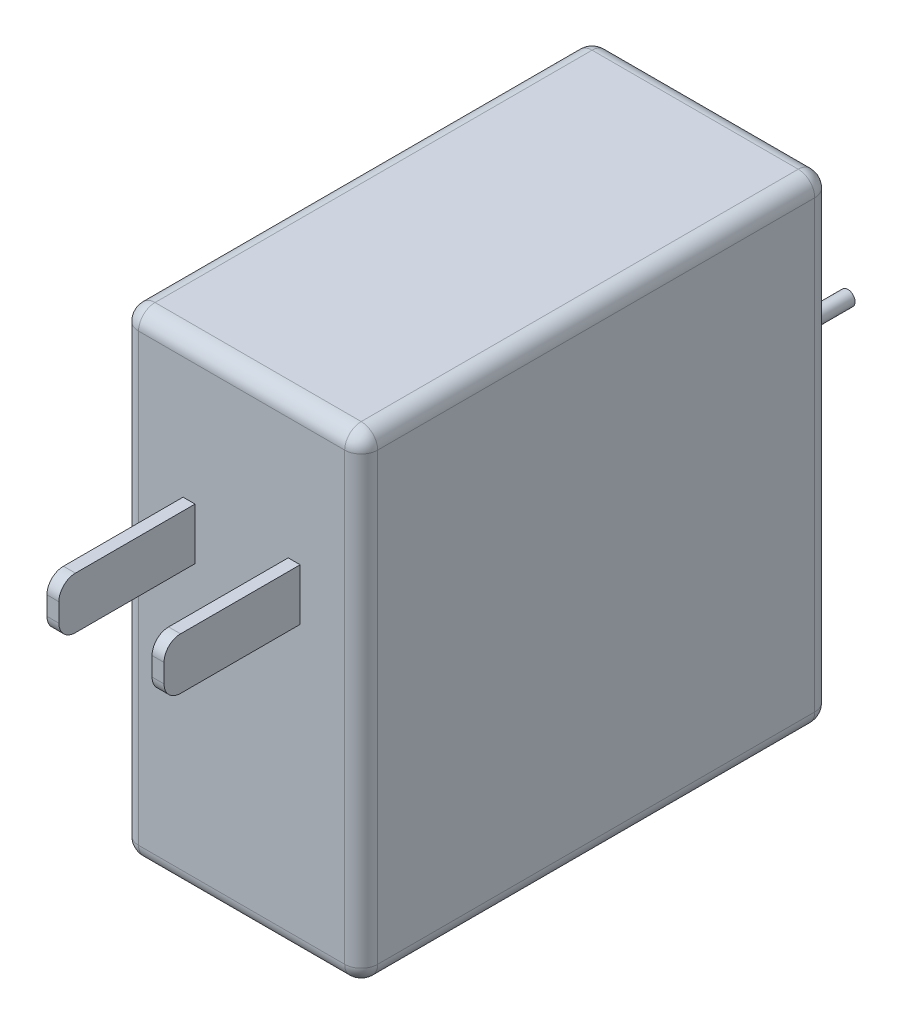
ISO-10303-21;
HEADER;
FILE_DESCRIPTION(('STEP AP214'),'2;1');
FILE_NAME('part.step','',(''),(''),'','','');
FILE_SCHEMA(('AUTOMOTIVE_DESIGN { 1 0 10303 214 1 1 1 1 }'));
ENDSEC;
DATA;
#1=APPLICATION_CONTEXT('core data for automotive mechanical design processes');
#2=APPLICATION_PROTOCOL_DEFINITION('international standard','automotive_design',2000,#1);
#3=PRODUCT_CONTEXT('',#1,'mechanical');
#4=PRODUCT('Part','Part','',(#3));
#5=PRODUCT_RELATED_PRODUCT_CATEGORY('part','',(#4));
#6=PRODUCT_DEFINITION_FORMATION('','',#4);
#7=PRODUCT_DEFINITION_CONTEXT('part definition',#1,'design');
#8=PRODUCT_DEFINITION('design','',#6,#7);
#9=PRODUCT_DEFINITION_SHAPE('','',#8);
#10=(LENGTH_UNIT() NAMED_UNIT(*) SI_UNIT(.MILLI.,.METRE.));
#11=(NAMED_UNIT(*) PLANE_ANGLE_UNIT() SI_UNIT($,.RADIAN.));
#12=(NAMED_UNIT(*) SI_UNIT($,.STERADIAN.) SOLID_ANGLE_UNIT());
#13=UNCERTAINTY_MEASURE_WITH_UNIT(LENGTH_MEASURE(1.E-05),#10,'distance_accuracy_value','');
#14=(GEOMETRIC_REPRESENTATION_CONTEXT(3) GLOBAL_UNCERTAINTY_ASSIGNED_CONTEXT((#13)) GLOBAL_UNIT_ASSIGNED_CONTEXT((#10,
#11,#12)) REPRESENTATION_CONTEXT('',''));
#15=CARTESIAN_POINT('',(0.,0.,0.));
#16=DIRECTION('',(0.,0.,1.));
#17=DIRECTION('',(1.,0.,0.));
#18=AXIS2_PLACEMENT_3D('',#15,#16,#17);
#19=CARTESIAN_POINT('',(0.,0.,-57.));
#20=DIRECTION('',(0.,0.,1.));
#21=DIRECTION('',(1.,0.,0.));
#22=AXIS2_PLACEMENT_3D('',#19,#20,#21);
#23=PLANE('',#22);
#24=DIRECTION('',(0.,-1.,0.));
#25=VECTOR('',#24,1.);
#26=CARTESIAN_POINT('',(-12.5,29.,-57.));
#27=LINE('',#26,#25);
#28=CARTESIAN_POINT('',(-12.5,-27.,-57.));
#29=VERTEX_POINT('',#28);
#30=CARTESIAN_POINT('',(-12.5,27.,-57.));
#31=VERTEX_POINT('',#30);
#32=EDGE_CURVE('E291',#29,#31,#27,.F.);
#33=ORIENTED_EDGE('',*,*,#32,.T.);
#34=DIRECTION('',(1.,0.,0.));
#35=VECTOR('',#34,1.);
#36=CARTESIAN_POINT('',(0.,27.,-57.));
#37=LINE('',#36,#35);
#38=CARTESIAN_POINT('',(12.5,27.,-57.));
#39=VERTEX_POINT('',#38);
#40=EDGE_CURVE('E293',#31,#39,#37,.T.);
#41=ORIENTED_EDGE('',*,*,#40,.T.);
#42=DIRECTION('',(0.,-1.,0.));
#43=VECTOR('',#42,1.);
#44=CARTESIAN_POINT('',(12.5,0.,-57.));
#45=LINE('',#44,#43);
#46=CARTESIAN_POINT('',(12.5,-27.,-57.));
#47=VERTEX_POINT('',#46);
#48=EDGE_CURVE('E287',#39,#47,#45,.T.);
#49=ORIENTED_EDGE('',*,*,#48,.T.);
#50=DIRECTION('',(1.,0.,0.));
#51=VECTOR('',#50,1.);
#52=CARTESIAN_POINT('',(-14.5,-27.,-57.));
#53=LINE('',#52,#51);
#54=EDGE_CURVE('E289',#47,#29,#53,.F.);
#55=ORIENTED_EDGE('',*,*,#54,.T.);
#56=EDGE_LOOP('',(#33,#41,#49,#55));
#57=FACE_BOUND('',#56,.T.);
#58=CARTESIAN_POINT('',(0.,0.,-57.));
#59=DIRECTION('',(0.,0.,1.));
#60=DIRECTION('',(1.,0.,0.));
#61=AXIS2_PLACEMENT_3D('',#58,#59,#60);
#62=CIRCLE('',#61,1.88845811923033);
#63=CARTESIAN_POINT('',(1.88845811923033,0.,-57.));
#64=VERTEX_POINT('',#63);
#65=EDGE_CURVE('E355',#64,#64,#62,.F.);
#66=ORIENTED_EDGE('',*,*,#65,.F.);
#67=EDGE_LOOP('',(#66));
#68=FACE_BOUND('',#67,.T.);
#69=ADVANCED_FACE('F38',(#57,#68),#23,.F.);
#70=CARTESIAN_POINT('',(14.5,0.,-57.));
#71=DIRECTION('',(-1.,0.,0.));
#72=DIRECTION('',(0.,-1.,0.));
#73=AXIS2_PLACEMENT_3D('',#70,#71,#72);
#74=PLANE('',#73);
#75=DIRECTION('',(0.,0.,1.));
#76=VECTOR('',#75,1.);
#77=CARTESIAN_POINT('',(14.5,-27.,-57.));
#78=LINE('',#77,#76);
#79=CARTESIAN_POINT('',(14.5,-27.,-2.));
#80=VERTEX_POINT('',#79);
#81=CARTESIAN_POINT('',(14.5,-27.,-55.));
#82=VERTEX_POINT('',#81);
#83=EDGE_CURVE('E298',#80,#82,#78,.F.);
#84=ORIENTED_EDGE('',*,*,#83,.T.);
#85=DIRECTION('',(0.,-1.,0.));
#86=VECTOR('',#85,1.);
#87=CARTESIAN_POINT('',(14.5,0.,-55.));
#88=LINE('',#87,#86);
#89=CARTESIAN_POINT('',(14.5,27.,-55.));
#90=VERTEX_POINT('',#89);
#91=EDGE_CURVE('E303',#82,#90,#88,.F.);
#92=ORIENTED_EDGE('',*,*,#91,.T.);
#93=DIRECTION('',(0.,0.,1.));
#94=VECTOR('',#93,1.);
#95=CARTESIAN_POINT('',(14.5,27.,-57.));
#96=LINE('',#95,#94);
#97=CARTESIAN_POINT('',(14.5,27.,-2.));
#98=VERTEX_POINT('',#97);
#99=EDGE_CURVE('E300',#90,#98,#96,.T.);
#100=ORIENTED_EDGE('',*,*,#99,.T.);
#101=DIRECTION('',(0.,-1.,0.));
#102=VECTOR('',#101,1.);
#103=CARTESIAN_POINT('',(14.5,-29.,-2.));
#104=LINE('',#103,#102);
#105=EDGE_CURVE('E296',#98,#80,#104,.T.);
#106=ORIENTED_EDGE('',*,*,#105,.T.);
#107=EDGE_LOOP('',(#84,#92,#100,#106));
#108=FACE_BOUND('',#107,.T.);
#109=ADVANCED_FACE('F438',(#108),#74,.F.);
#110=CARTESIAN_POINT('',(0.,-29.,-57.));
#111=DIRECTION('',(0.,-1.,0.));
#112=DIRECTION('',(0.,0.,-1.));
#113=AXIS2_PLACEMENT_3D('',#110,#111,#112);
#114=PLANE('',#113);
#115=DIRECTION('',(0.,0.,1.));
#116=VECTOR('',#115,1.);
#117=CARTESIAN_POINT('',(12.5,-29.,0.));
#118=LINE('',#117,#116);
#119=CARTESIAN_POINT('',(12.5,-29.,-55.));
#120=VERTEX_POINT('',#119);
#121=CARTESIAN_POINT('',(12.5,-29.,-2.));
#122=VERTEX_POINT('',#121);
#123=EDGE_CURVE('E348',#120,#122,#118,.T.);
#124=ORIENTED_EDGE('',*,*,#123,.T.);
#125=DIRECTION('',(1.,0.,0.));
#126=VECTOR('',#125,1.);
#127=CARTESIAN_POINT('',(0.,-29.,-2.));
#128=LINE('',#127,#126);
#129=CARTESIAN_POINT('',(-12.5,-29.,-2.));
#130=VERTEX_POINT('',#129);
#131=EDGE_CURVE('E353',#122,#130,#128,.F.);
#132=ORIENTED_EDGE('',*,*,#131,.T.);
#133=DIRECTION('',(0.,0.,1.));
#134=VECTOR('',#133,1.);
#135=CARTESIAN_POINT('',(-12.5,-29.,-57.));
#136=LINE('',#135,#134);
#137=CARTESIAN_POINT('',(-12.5,-29.,-55.));
#138=VERTEX_POINT('',#137);
#139=EDGE_CURVE('E61',#130,#138,#136,.F.);
#140=ORIENTED_EDGE('',*,*,#139,.T.);
#141=DIRECTION('',(1.,0.,0.));
#142=VECTOR('',#141,1.);
#143=CARTESIAN_POINT('',(14.5,-29.,-55.));
#144=LINE('',#143,#142);
#145=EDGE_CURVE('E350',#138,#120,#144,.T.);
#146=ORIENTED_EDGE('',*,*,#145,.T.);
#147=EDGE_LOOP('',(#124,#132,#140,#146));
#148=FACE_BOUND('',#147,.T.);
#149=ADVANCED_FACE('F444',(#148),#114,.T.);
#150=CARTESIAN_POINT('',(-14.5,0.,-57.));
#151=DIRECTION('',(-1.,0.,0.));
#152=DIRECTION('',(0.,-1.,0.));
#153=AXIS2_PLACEMENT_3D('',#150,#151,#152);
#154=PLANE('',#153);
#155=DIRECTION('',(0.,-1.,0.));
#156=VECTOR('',#155,1.);
#157=CARTESIAN_POINT('',(-14.5,0.,-2.));
#158=LINE('',#157,#156);
#159=CARTESIAN_POINT('',(-14.5,-27.,-2.));
#160=VERTEX_POINT('',#159);
#161=CARTESIAN_POINT('',(-14.5,27.,-2.));
#162=VERTEX_POINT('',#161);
#163=EDGE_CURVE('E282',#160,#162,#158,.F.);
#164=ORIENTED_EDGE('',*,*,#163,.T.);
#165=DIRECTION('',(0.,0.,1.));
#166=VECTOR('',#165,1.);
#167=CARTESIAN_POINT('',(-14.5,27.,-57.));
#168=LINE('',#167,#166);
#169=CARTESIAN_POINT('',(-14.5,27.,-55.));
#170=VERTEX_POINT('',#169);
#171=EDGE_CURVE('E284',#162,#170,#168,.F.);
#172=ORIENTED_EDGE('',*,*,#171,.T.);
#173=DIRECTION('',(0.,-1.,0.));
#174=VECTOR('',#173,1.);
#175=CARTESIAN_POINT('',(-14.5,-29.,-55.));
#176=LINE('',#175,#174);
#177=CARTESIAN_POINT('',(-14.5,-27.,-55.));
#178=VERTEX_POINT('',#177);
#179=EDGE_CURVE('E280',#170,#178,#176,.T.);
#180=ORIENTED_EDGE('',*,*,#179,.T.);
#181=DIRECTION('',(0.,0.,1.));
#182=VECTOR('',#181,1.);
#183=CARTESIAN_POINT('',(-14.5,-27.,-57.));
#184=LINE('',#183,#182);
#185=EDGE_CURVE('E278',#178,#160,#184,.T.);
#186=ORIENTED_EDGE('',*,*,#185,.T.);
#187=EDGE_LOOP('',(#164,#172,#180,#186));
#188=FACE_BOUND('',#187,.T.);
#189=ADVANCED_FACE('F458',(#188),#154,.T.);
#190=CARTESIAN_POINT('',(0.,29.,-57.));
#191=DIRECTION('',(0.,-1.,0.));
#192=DIRECTION('',(0.,0.,-1.));
#193=AXIS2_PLACEMENT_3D('',#190,#191,#192);
#194=PLANE('',#193);
#195=DIRECTION('',(1.,0.,0.));
#196=VECTOR('',#195,1.);
#197=CARTESIAN_POINT('',(0.,29.,-55.));
#198=LINE('',#197,#196);
#199=CARTESIAN_POINT('',(12.5,29.,-55.));
#200=VERTEX_POINT('',#199);
#201=CARTESIAN_POINT('',(-12.5,29.,-55.));
#202=VERTEX_POINT('',#201);
#203=EDGE_CURVE('E273',#200,#202,#198,.F.);
#204=ORIENTED_EDGE('',*,*,#203,.T.);
#205=DIRECTION('',(0.,0.,1.));
#206=VECTOR('',#205,1.);
#207=CARTESIAN_POINT('',(-12.5,29.,0.));
#208=LINE('',#207,#206);
#209=CARTESIAN_POINT('',(-12.5,29.,-2.));
#210=VERTEX_POINT('',#209);
#211=EDGE_CURVE('E275',#202,#210,#208,.T.);
#212=ORIENTED_EDGE('',*,*,#211,.T.);
#213=DIRECTION('',(1.,0.,0.));
#214=VECTOR('',#213,1.);
#215=CARTESIAN_POINT('',(14.5,29.,-2.));
#216=LINE('',#215,#214);
#217=CARTESIAN_POINT('',(12.5,29.,-2.));
#218=VERTEX_POINT('',#217);
#219=EDGE_CURVE('E269',#210,#218,#216,.T.);
#220=ORIENTED_EDGE('',*,*,#219,.T.);
#221=DIRECTION('',(0.,0.,1.));
#222=VECTOR('',#221,1.);
#223=CARTESIAN_POINT('',(12.5,29.,-57.));
#224=LINE('',#223,#222);
#225=EDGE_CURVE('E271',#218,#200,#224,.F.);
#226=ORIENTED_EDGE('',*,*,#225,.T.);
#227=EDGE_LOOP('',(#204,#212,#220,#226));
#228=FACE_BOUND('',#227,.T.);
#229=ADVANCED_FACE('F454',(#228),#194,.F.);
#230=CARTESIAN_POINT('',(0.,0.,0.));
#231=DIRECTION('',(0.,0.,1.));
#232=DIRECTION('',(1.,0.,0.));
#233=AXIS2_PLACEMENT_3D('',#230,#231,#232);
#234=PLANE('',#233);
#235=DIRECTION('',(1.,0.,0.));
#236=VECTOR('',#235,1.);
#237=CARTESIAN_POINT('',(-14.5,27.,0.));
#238=LINE('',#237,#236);
#239=CARTESIAN_POINT('',(12.5,27.,0.));
#240=VERTEX_POINT('',#239);
#241=CARTESIAN_POINT('',(-12.5,27.,0.));
#242=VERTEX_POINT('',#241);
#243=EDGE_CURVE('E309',#240,#242,#238,.F.);
#244=ORIENTED_EDGE('',*,*,#243,.T.);
#245=DIRECTION('',(0.,-1.,0.));
#246=VECTOR('',#245,1.);
#247=CARTESIAN_POINT('',(-12.5,0.,0.));
#248=LINE('',#247,#246);
#249=CARTESIAN_POINT('',(-12.5,-27.,0.));
#250=VERTEX_POINT('',#249);
#251=EDGE_CURVE('E312',#242,#250,#248,.T.);
#252=ORIENTED_EDGE('',*,*,#251,.T.);
#253=DIRECTION('',(1.,0.,0.));
#254=VECTOR('',#253,1.);
#255=CARTESIAN_POINT('',(0.,-27.,0.));
#256=LINE('',#255,#254);
#257=CARTESIAN_POINT('',(12.5,-27.,0.));
#258=VERTEX_POINT('',#257);
#259=EDGE_CURVE('E307',#250,#258,#256,.T.);
#260=ORIENTED_EDGE('',*,*,#259,.T.);
#261=DIRECTION('',(0.,-1.,0.));
#262=VECTOR('',#261,1.);
#263=CARTESIAN_POINT('',(12.5,29.,0.));
#264=LINE('',#263,#262);
#265=EDGE_CURVE('E305',#258,#240,#264,.F.);
#266=ORIENTED_EDGE('',*,*,#265,.T.);
#267=EDGE_LOOP('',(#244,#252,#260,#266));
#268=FACE_BOUND('',#267,.T.);
#269=DIRECTION('',(-1.,0.,0.));
#270=VECTOR('',#269,1.);
#271=CARTESIAN_POINT('',(0.,6.00000000000001,0.));
#272=LINE('',#271,#270);
#273=CARTESIAN_POINT('',(7.10000000000001,6.00000000000001,0.));
#274=VERTEX_POINT('',#273);
#275=CARTESIAN_POINT('',(5.65000000000001,6.00000000000001,0.));
#276=VERTEX_POINT('',#275);
#277=EDGE_CURVE('E219',#274,#276,#272,.T.);
#278=ORIENTED_EDGE('',*,*,#277,.T.);
#279=DIRECTION('',(0.,-1.,0.));
#280=VECTOR('',#279,1.);
#281=CARTESIAN_POINT('',(5.65000000000001,0.,0.));
#282=LINE('',#281,#280);
#283=CARTESIAN_POINT('',(5.65000000000001,12.26,0.));
#284=VERTEX_POINT('',#283);
#285=EDGE_CURVE('E233',#284,#276,#282,.T.);
#286=ORIENTED_EDGE('',*,*,#285,.F.);
#287=DIRECTION('',(-1.,0.,0.));
#288=VECTOR('',#287,1.);
#289=CARTESIAN_POINT('',(0.,12.26,0.));
#290=LINE('',#289,#288);
#291=CARTESIAN_POINT('',(7.10000000000001,12.26,0.));
#292=VERTEX_POINT('',#291);
#293=EDGE_CURVE('E231',#292,#284,#290,.T.);
#294=ORIENTED_EDGE('',*,*,#293,.F.);
#295=DIRECTION('',(0.,-1.,0.));
#296=VECTOR('',#295,1.);
#297=CARTESIAN_POINT('',(7.10000000000001,0.,0.));
#298=LINE('',#297,#296);
#299=EDGE_CURVE('E208',#292,#274,#298,.T.);
#300=ORIENTED_EDGE('',*,*,#299,.T.);
#301=EDGE_LOOP('',(#278,#286,#294,#300));
#302=FACE_BOUND('',#301,.T.);
#303=DIRECTION('',(0.,-1.,0.));
#304=VECTOR('',#303,1.);
#305=CARTESIAN_POINT('',(-5.65,0.,0.));
#306=LINE('',#305,#304);
#307=CARTESIAN_POINT('',(-5.65,12.26,0.));
#308=VERTEX_POINT('',#307);
#309=CARTESIAN_POINT('',(-5.65,6.00000000000001,0.));
#310=VERTEX_POINT('',#309);
#311=EDGE_CURVE('E215',#308,#310,#306,.T.);
#312=ORIENTED_EDGE('',*,*,#311,.T.);
#313=DIRECTION('',(1.,0.,0.));
#314=VECTOR('',#313,1.);
#315=CARTESIAN_POINT('',(0.,6.00000000000001,0.));
#316=LINE('',#315,#314);
#317=CARTESIAN_POINT('',(-7.10000000000001,6.00000000000001,0.));
#318=VERTEX_POINT('',#317);
#319=EDGE_CURVE('E248',#318,#310,#316,.T.);
#320=ORIENTED_EDGE('',*,*,#319,.F.);
#321=DIRECTION('',(0.,-1.,0.));
#322=VECTOR('',#321,1.);
#323=CARTESIAN_POINT('',(-7.10000000000003,0.,0.));
#324=LINE('',#323,#322);
#325=CARTESIAN_POINT('',(-7.09999999999998,12.26,0.));
#326=VERTEX_POINT('',#325);
#327=EDGE_CURVE('E257',#326,#318,#324,.T.);
#328=ORIENTED_EDGE('',*,*,#327,.F.);
#329=DIRECTION('',(1.,0.,0.));
#330=VECTOR('',#329,1.);
#331=CARTESIAN_POINT('',(0.,12.26,0.));
#332=LINE('',#331,#330);
#333=EDGE_CURVE('E254',#326,#308,#332,.T.);
#334=ORIENTED_EDGE('',*,*,#333,.T.);
#335=EDGE_LOOP('',(#312,#320,#328,#334));
#336=FACE_BOUND('',#335,.T.);
#337=ADVANCED_FACE('F228',(#268,#302,#336),#234,.T.);
#338=CARTESIAN_POINT('',(-5.65,0.,16.51));
#339=DIRECTION('',(1.,0.,0.));
#340=DIRECTION('',(0.,0.,-1.));
#341=AXIS2_PLACEMENT_3D('',#338,#339,#340);
#342=PLANE('',#341);
#343=DIRECTION('',(0.,0.,-1.));
#344=VECTOR('',#343,1.);
#345=CARTESIAN_POINT('',(-5.65,12.26,16.51));
#346=LINE('',#345,#344);
#347=CARTESIAN_POINT('',(-5.65,12.26,14.51));
#348=VERTEX_POINT('',#347);
#349=EDGE_CURVE('E267',#348,#308,#346,.T.);
#350=ORIENTED_EDGE('',*,*,#349,.F.);
#351=CARTESIAN_POINT('',(-5.65,10.26,14.51));
#352=DIRECTION('',(1.,0.,0.));
#353=DIRECTION('',(0.,0.,-1.));
#354=AXIS2_PLACEMENT_3D('',#351,#352,#353);
#355=CIRCLE('',#354,2.);
#356=CARTESIAN_POINT('',(-5.65,10.26,16.51));
#357=VERTEX_POINT('',#356);
#358=EDGE_CURVE('E319',#348,#357,#355,.T.);
#359=ORIENTED_EDGE('',*,*,#358,.T.);
#360=DIRECTION('',(0.,-1.,0.));
#361=VECTOR('',#360,1.);
#362=CARTESIAN_POINT('',(-5.65,0.,16.51));
#363=LINE('',#362,#361);
#364=CARTESIAN_POINT('',(-5.65,8.00000000000001,16.51));
#365=VERTEX_POINT('',#364);
#366=EDGE_CURVE('E244',#357,#365,#363,.T.);
#367=ORIENTED_EDGE('',*,*,#366,.T.);
#368=CARTESIAN_POINT('',(-5.65,8.00000000000001,14.51));
#369=DIRECTION('',(1.,0.,0.));
#370=DIRECTION('',(0.,0.,-1.));
#371=AXIS2_PLACEMENT_3D('',#368,#369,#370);
#372=CIRCLE('',#371,2.);
#373=CARTESIAN_POINT('',(-5.65,6.00000000000001,14.51));
#374=VERTEX_POINT('',#373);
#375=EDGE_CURVE('E317',#365,#374,#372,.T.);
#376=ORIENTED_EDGE('',*,*,#375,.T.);
#377=DIRECTION('',(0.,0.,-1.));
#378=VECTOR('',#377,1.);
#379=CARTESIAN_POINT('',(-5.65,6.00000000000001,16.51));
#380=LINE('',#379,#378);
#381=EDGE_CURVE('E251',#374,#310,#380,.T.);
#382=ORIENTED_EDGE('',*,*,#381,.T.);
#383=ORIENTED_EDGE('',*,*,#311,.F.);
#384=EDGE_LOOP('',(#350,#359,#367,#376,#382,#383));
#385=FACE_BOUND('',#384,.T.);
#386=ADVANCED_FACE('F450',(#385),#342,.T.);
#387=CARTESIAN_POINT('',(0.,12.26,16.51));
#388=DIRECTION('',(0.,1.,0.));
#389=DIRECTION('',(0.,0.,1.));
#390=AXIS2_PLACEMENT_3D('',#387,#388,#389);
#391=PLANE('',#390);
#392=DIRECTION('',(0.,0.,-1.));
#393=VECTOR('',#392,1.);
#394=CARTESIAN_POINT('',(-7.09999999999998,12.26,16.51));
#395=LINE('',#394,#393);
#396=CARTESIAN_POINT('',(-7.09999999999998,12.26,14.51));
#397=VERTEX_POINT('',#396);
#398=EDGE_CURVE('E265',#397,#326,#395,.T.);
#399=ORIENTED_EDGE('',*,*,#398,.F.);
#400=DIRECTION('',(1.,0.,0.));
#401=VECTOR('',#400,1.);
#402=CARTESIAN_POINT('',(0.,12.26,14.51));
#403=LINE('',#402,#401);
#404=EDGE_CURVE('E314',#397,#348,#403,.T.);
#405=ORIENTED_EDGE('',*,*,#404,.T.);
#406=ORIENTED_EDGE('',*,*,#349,.T.);
#407=ORIENTED_EDGE('',*,*,#333,.F.);
#408=EDGE_LOOP('',(#399,#405,#406,#407));
#409=FACE_BOUND('',#408,.T.);
#410=ADVANCED_FACE('F614',(#409),#391,.T.);
#411=CARTESIAN_POINT('',(-7.10000000000003,0.,16.51));
#412=DIRECTION('',(1.,0.,0.));
#413=DIRECTION('',(0.,1.,0.));
#414=AXIS2_PLACEMENT_3D('',#411,#412,#413);
#415=PLANE('',#414);
#416=DIRECTION('',(0.,-1.,0.));
#417=VECTOR('',#416,1.);
#418=CARTESIAN_POINT('',(-7.10000000000003,0.,16.51));
#419=LINE('',#418,#417);
#420=CARTESIAN_POINT('',(-7.09999999999999,10.26,16.51));
#421=VERTEX_POINT('',#420);
#422=CARTESIAN_POINT('',(-7.1,8.00000000000001,16.51));
#423=VERTEX_POINT('',#422);
#424=EDGE_CURVE('E247',#421,#423,#419,.T.);
#425=ORIENTED_EDGE('',*,*,#424,.F.);
#426=CARTESIAN_POINT('',(-7.09999999999999,10.26,14.51));
#427=DIRECTION('',(1.,0.,0.));
#428=DIRECTION('',(0.,1.,0.));
#429=AXIS2_PLACEMENT_3D('',#426,#427,#428);
#430=CIRCLE('',#429,2.);
#431=EDGE_CURVE('E328',#421,#397,#430,.F.);
#432=ORIENTED_EDGE('',*,*,#431,.T.);
#433=ORIENTED_EDGE('',*,*,#398,.T.);
#434=ORIENTED_EDGE('',*,*,#327,.T.);
#435=DIRECTION('',(0.,0.,-1.));
#436=VECTOR('',#435,1.);
#437=CARTESIAN_POINT('',(-7.10000000000001,6.00000000000001,16.51));
#438=LINE('',#437,#436);
#439=CARTESIAN_POINT('',(-7.10000000000001,6.00000000000001,14.51));
#440=VERTEX_POINT('',#439);
#441=EDGE_CURVE('E263',#440,#318,#438,.T.);
#442=ORIENTED_EDGE('',*,*,#441,.F.);
#443=CARTESIAN_POINT('',(-7.1,8.00000000000001,14.51));
#444=DIRECTION('',(1.,0.,0.));
#445=DIRECTION('',(0.,1.,0.));
#446=AXIS2_PLACEMENT_3D('',#443,#444,#445);
#447=CIRCLE('',#446,2.);
#448=EDGE_CURVE('E326',#440,#423,#447,.F.);
#449=ORIENTED_EDGE('',*,*,#448,.T.);
#450=EDGE_LOOP('',(#425,#432,#433,#434,#442,#449));
#451=FACE_BOUND('',#450,.T.);
#452=ADVANCED_FACE('F611',(#451),#415,.F.);
#453=CARTESIAN_POINT('',(0.,6.00000000000001,16.51));
#454=DIRECTION('',(0.,1.,0.));
#455=DIRECTION('',(0.,0.,1.));
#456=AXIS2_PLACEMENT_3D('',#453,#454,#455);
#457=PLANE('',#456);
#458=ORIENTED_EDGE('',*,*,#381,.F.);
#459=DIRECTION('',(1.,0.,0.));
#460=VECTOR('',#459,1.);
#461=CARTESIAN_POINT('',(-7.10000000000001,6.00000000000001,14.51));
#462=LINE('',#461,#460);
#463=EDGE_CURVE('E330',#374,#440,#462,.F.);
#464=ORIENTED_EDGE('',*,*,#463,.T.);
#465=ORIENTED_EDGE('',*,*,#441,.T.);
#466=ORIENTED_EDGE('',*,*,#319,.T.);
#467=EDGE_LOOP('',(#458,#464,#465,#466));
#468=FACE_BOUND('',#467,.T.);
#469=ADVANCED_FACE('F607',(#468),#457,.F.);
#470=CARTESIAN_POINT('',(0.,0.,16.51));
#471=DIRECTION('',(0.,0.,1.));
#472=DIRECTION('',(1.,0.,0.));
#473=AXIS2_PLACEMENT_3D('',#470,#471,#472);
#474=PLANE('',#473);
#475=ORIENTED_EDGE('',*,*,#366,.F.);
#476=DIRECTION('',(1.,0.,0.));
#477=VECTOR('',#476,1.);
#478=CARTESIAN_POINT('',(0.,10.26,16.51));
#479=LINE('',#478,#477);
#480=EDGE_CURVE('E324',#357,#421,#479,.F.);
#481=ORIENTED_EDGE('',*,*,#480,.T.);
#482=ORIENTED_EDGE('',*,*,#424,.T.);
#483=DIRECTION('',(1.,0.,0.));
#484=VECTOR('',#483,1.);
#485=CARTESIAN_POINT('',(-5.65,8.00000000000001,16.51));
#486=LINE('',#485,#484);
#487=EDGE_CURVE('E321',#423,#365,#486,.T.);
#488=ORIENTED_EDGE('',*,*,#487,.T.);
#489=EDGE_LOOP('',(#475,#481,#482,#488));
#490=FACE_BOUND('',#489,.T.);
#491=ADVANCED_FACE('F604',(#490),#474,.T.);
#492=CARTESIAN_POINT('',(0.,6.00000000000001,16.51));
#493=DIRECTION('',(0.,-1.,0.));
#494=DIRECTION('',(0.,0.,-1.));
#495=AXIS2_PLACEMENT_3D('',#492,#493,#494);
#496=PLANE('',#495);
#497=DIRECTION('',(0.,0.,-1.));
#498=VECTOR('',#497,1.);
#499=CARTESIAN_POINT('',(7.10000000000001,6.00000000000001,16.51));
#500=LINE('',#499,#498);
#501=CARTESIAN_POINT('',(7.10000000000001,6.00000000000001,14.51));
#502=VERTEX_POINT('',#501);
#503=EDGE_CURVE('E202',#502,#274,#500,.T.);
#504=ORIENTED_EDGE('',*,*,#503,.F.);
#505=DIRECTION('',(-1.,0.,0.));
#506=VECTOR('',#505,1.);
#507=CARTESIAN_POINT('',(0.,6.00000000000001,14.51));
#508=LINE('',#507,#506);
#509=CARTESIAN_POINT('',(5.65000000000001,6.00000000000001,14.51));
#510=VERTEX_POINT('',#509);
#511=EDGE_CURVE('E332',#502,#510,#508,.T.);
#512=ORIENTED_EDGE('',*,*,#511,.T.);
#513=DIRECTION('',(0.,0.,-1.));
#514=VECTOR('',#513,1.);
#515=CARTESIAN_POINT('',(5.65000000000001,6.00000000000001,16.51));
#516=LINE('',#515,#514);
#517=EDGE_CURVE('E222',#510,#276,#516,.T.);
#518=ORIENTED_EDGE('',*,*,#517,.T.);
#519=ORIENTED_EDGE('',*,*,#277,.F.);
#520=EDGE_LOOP('',(#504,#512,#518,#519));
#521=FACE_BOUND('',#520,.T.);
#522=ADVANCED_FACE('F220',(#521),#496,.T.);
#523=CARTESIAN_POINT('',(7.10000000000001,0.,16.51));
#524=DIRECTION('',(1.,0.,0.));
#525=DIRECTION('',(0.,0.,-1.));
#526=AXIS2_PLACEMENT_3D('',#523,#524,#525);
#527=PLANE('',#526);
#528=DIRECTION('',(0.,-1.,0.));
#529=VECTOR('',#528,1.);
#530=CARTESIAN_POINT('',(7.10000000000001,0.,16.51));
#531=LINE('',#530,#529);
#532=CARTESIAN_POINT('',(7.10000000000001,10.26,16.51));
#533=VERTEX_POINT('',#532);
#534=CARTESIAN_POINT('',(7.10000000000001,8.00000000000001,16.51));
#535=VERTEX_POINT('',#534);
#536=EDGE_CURVE('E238',#533,#535,#531,.T.);
#537=ORIENTED_EDGE('',*,*,#536,.T.);
#538=CARTESIAN_POINT('',(7.10000000000001,8.00000000000001,14.51));
#539=DIRECTION('',(1.,0.,0.));
#540=DIRECTION('',(0.,0.,-1.));
#541=AXIS2_PLACEMENT_3D('',#538,#539,#540);
#542=CIRCLE('',#541,2.);
#543=EDGE_CURVE('E211',#535,#502,#542,.T.);
#544=ORIENTED_EDGE('',*,*,#543,.T.);
#545=ORIENTED_EDGE('',*,*,#503,.T.);
#546=ORIENTED_EDGE('',*,*,#299,.F.);
#547=DIRECTION('',(0.,0.,-1.));
#548=VECTOR('',#547,1.);
#549=CARTESIAN_POINT('',(7.10000000000001,12.26,16.51));
#550=LINE('',#549,#548);
#551=CARTESIAN_POINT('',(7.10000000000001,12.26,14.51));
#552=VERTEX_POINT('',#551);
#553=EDGE_CURVE('E216',#552,#292,#550,.T.);
#554=ORIENTED_EDGE('',*,*,#553,.F.);
#555=CARTESIAN_POINT('',(7.10000000000001,10.26,14.51));
#556=DIRECTION('',(1.,0.,0.));
#557=DIRECTION('',(0.,0.,-1.));
#558=AXIS2_PLACEMENT_3D('',#555,#556,#557);
#559=CIRCLE('',#558,2.);
#560=EDGE_CURVE('E343',#552,#533,#559,.T.);
#561=ORIENTED_EDGE('',*,*,#560,.T.);
#562=EDGE_LOOP('',(#537,#544,#545,#546,#554,#561));
#563=FACE_BOUND('',#562,.T.);
#564=ADVANCED_FACE('F205',(#563),#527,.T.);
#565=CARTESIAN_POINT('',(0.,12.26,16.51));
#566=DIRECTION('',(0.,-1.,0.));
#567=DIRECTION('',(0.,0.,-1.));
#568=AXIS2_PLACEMENT_3D('',#565,#566,#567);
#569=PLANE('',#568);
#570=DIRECTION('',(0.,0.,-1.));
#571=VECTOR('',#570,1.);
#572=CARTESIAN_POINT('',(5.65000000000001,12.26,16.51));
#573=LINE('',#572,#571);
#574=CARTESIAN_POINT('',(5.65000000000001,12.26,14.51));
#575=VERTEX_POINT('',#574);
#576=EDGE_CURVE('E240',#575,#284,#573,.T.);
#577=ORIENTED_EDGE('',*,*,#576,.F.);
#578=DIRECTION('',(-1.,0.,0.));
#579=VECTOR('',#578,1.);
#580=CARTESIAN_POINT('',(7.10000000000001,12.26,14.51));
#581=LINE('',#580,#579);
#582=EDGE_CURVE('E346',#575,#552,#581,.F.);
#583=ORIENTED_EDGE('',*,*,#582,.T.);
#584=ORIENTED_EDGE('',*,*,#553,.T.);
#585=ORIENTED_EDGE('',*,*,#293,.T.);
#586=EDGE_LOOP('',(#577,#583,#584,#585));
#587=FACE_BOUND('',#586,.T.);
#588=ADVANCED_FACE('F595',(#587),#569,.F.);
#589=CARTESIAN_POINT('',(5.65000000000001,0.,16.51));
#590=DIRECTION('',(1.,0.,0.));
#591=DIRECTION('',(0.,0.,-1.));
#592=AXIS2_PLACEMENT_3D('',#589,#590,#591);
#593=PLANE('',#592);
#594=ORIENTED_EDGE('',*,*,#517,.F.);
#595=CARTESIAN_POINT('',(5.65000000000001,8.00000000000001,14.51));
#596=DIRECTION('',(1.,0.,0.));
#597=DIRECTION('',(0.,0.,-1.));
#598=AXIS2_PLACEMENT_3D('',#595,#596,#597);
#599=CIRCLE('',#598,2.);
#600=CARTESIAN_POINT('',(5.65000000000001,8.00000000000001,16.51));
#601=VERTEX_POINT('',#600);
#602=EDGE_CURVE('E336',#510,#601,#599,.F.);
#603=ORIENTED_EDGE('',*,*,#602,.T.);
#604=DIRECTION('',(0.,-1.,0.));
#605=VECTOR('',#604,1.);
#606=CARTESIAN_POINT('',(5.65000000000001,0.,16.51));
#607=LINE('',#606,#605);
#608=CARTESIAN_POINT('',(5.65000000000001,10.26,16.51));
#609=VERTEX_POINT('',#608);
#610=EDGE_CURVE('E241',#609,#601,#607,.T.);
#611=ORIENTED_EDGE('',*,*,#610,.F.);
#612=CARTESIAN_POINT('',(5.65000000000001,10.26,14.51));
#613=DIRECTION('',(1.,0.,0.));
#614=DIRECTION('',(0.,0.,-1.));
#615=AXIS2_PLACEMENT_3D('',#612,#613,#614);
#616=CIRCLE('',#615,2.);
#617=EDGE_CURVE('E334',#609,#575,#616,.F.);
#618=ORIENTED_EDGE('',*,*,#617,.T.);
#619=ORIENTED_EDGE('',*,*,#576,.T.);
#620=ORIENTED_EDGE('',*,*,#285,.T.);
#621=EDGE_LOOP('',(#594,#603,#611,#618,#619,#620));
#622=FACE_BOUND('',#621,.T.);
#623=ADVANCED_FACE('F592',(#622),#593,.F.);
#624=CARTESIAN_POINT('',(0.,0.,16.51));
#625=DIRECTION('',(0.,0.,1.));
#626=DIRECTION('',(1.,0.,0.));
#627=AXIS2_PLACEMENT_3D('',#624,#625,#626);
#628=PLANE('',#627);
#629=ORIENTED_EDGE('',*,*,#610,.T.);
#630=DIRECTION('',(-1.,0.,0.));
#631=VECTOR('',#630,1.);
#632=CARTESIAN_POINT('',(0.,8.00000000000001,16.51));
#633=LINE('',#632,#631);
#634=EDGE_CURVE('E341',#601,#535,#633,.F.);
#635=ORIENTED_EDGE('',*,*,#634,.T.);
#636=ORIENTED_EDGE('',*,*,#536,.F.);
#637=DIRECTION('',(-1.,0.,0.));
#638=VECTOR('',#637,1.);
#639=CARTESIAN_POINT('',(5.65000000000001,10.26,16.51));
#640=LINE('',#639,#638);
#641=EDGE_CURVE('E338',#533,#609,#640,.T.);
#642=ORIENTED_EDGE('',*,*,#641,.T.);
#643=EDGE_LOOP('',(#629,#635,#636,#642));
#644=FACE_BOUND('',#643,.T.);
#645=ADVANCED_FACE('F544',(#644),#628,.T.);
#646=CARTESIAN_POINT('',(12.5,-27.,-57.));
#647=DIRECTION('',(0.,0.,-1.));
#648=DIRECTION('',(-1.,0.,0.));
#649=AXIS2_PLACEMENT_3D('',#646,#647,#648);
#650=CYLINDRICAL_SURFACE('',#649,2.);
#651=CARTESIAN_POINT('',(12.5,-27.,-55.));
#652=DIRECTION('',(0.,0.,-1.));
#653=DIRECTION('',(-1.,0.,0.));
#654=AXIS2_PLACEMENT_3D('',#651,#652,#653);
#655=CIRCLE('',#654,2.);
#656=EDGE_CURVE('E226',#82,#120,#655,.T.);
#657=ORIENTED_EDGE('',*,*,#656,.F.);
#658=ORIENTED_EDGE('',*,*,#83,.F.);
#659=CARTESIAN_POINT('',(12.5,-27.,-2.));
#660=DIRECTION('',(0.,0.,1.));
#661=DIRECTION('',(1.,0.,0.));
#662=AXIS2_PLACEMENT_3D('',#659,#660,#661);
#663=CIRCLE('',#662,2.);
#664=EDGE_CURVE('E415',#122,#80,#663,.T.);
#665=ORIENTED_EDGE('',*,*,#664,.F.);
#666=ORIENTED_EDGE('',*,*,#123,.F.);
#667=EDGE_LOOP('',(#657,#658,#665,#666));
#668=FACE_BOUND('',#667,.T.);
#669=ADVANCED_FACE('F540',(#668),#650,.T.);
#670=CARTESIAN_POINT('',(12.5,-27.,-55.));
#671=DIRECTION('',(0.,-1.,0.));
#672=DIRECTION('',(0.,0.,-1.));
#673=AXIS2_PLACEMENT_3D('',#670,#671,#672);
#674=SPHERICAL_SURFACE('',#673,2.);
#675=CARTESIAN_POINT('',(12.5,-27.,-55.));
#676=DIRECTION('',(0.,-1.,0.));
#677=DIRECTION('',(0.,0.,-1.));
#678=AXIS2_PLACEMENT_3D('',#675,#676,#677);
#679=CIRCLE('',#678,2.);
#680=EDGE_CURVE('E409',#82,#47,#679,.F.);
#681=ORIENTED_EDGE('',*,*,#680,.F.);
#682=ORIENTED_EDGE('',*,*,#656,.T.);
#683=CARTESIAN_POINT('',(12.5,-27.,-55.));
#684=DIRECTION('',(1.,0.,0.));
#685=DIRECTION('',(0.,0.,-1.));
#686=AXIS2_PLACEMENT_3D('',#683,#684,#685);
#687=CIRCLE('',#686,2.);
#688=EDGE_CURVE('E412',#47,#120,#687,.F.);
#689=ORIENTED_EDGE('',*,*,#688,.F.);
#690=EDGE_LOOP('',(#681,#682,#689));
#691=FACE_BOUND('',#690,.T.);
#692=ADVANCED_FACE('F536',(#691),#674,.T.);
#693=CARTESIAN_POINT('',(12.5,-27.,-2.));
#694=DIRECTION('',(1.,0.,0.));
#695=DIRECTION('',(0.,0.,-1.));
#696=AXIS2_PLACEMENT_3D('',#693,#694,#695);
#697=SPHERICAL_SURFACE('',#696,2.);
#698=CARTESIAN_POINT('',(12.5,-27.,-2.));
#699=DIRECTION('',(1.,0.,0.));
#700=DIRECTION('',(0.,0.,-1.));
#701=AXIS2_PLACEMENT_3D('',#698,#699,#700);
#702=CIRCLE('',#701,2.);
#703=EDGE_CURVE('E403',#122,#258,#702,.F.);
#704=ORIENTED_EDGE('',*,*,#703,.F.);
#705=ORIENTED_EDGE('',*,*,#664,.T.);
#706=CARTESIAN_POINT('',(12.5,-27.,-2.));
#707=DIRECTION('',(0.,-1.,0.));
#708=DIRECTION('',(0.,0.,-1.));
#709=AXIS2_PLACEMENT_3D('',#706,#707,#708);
#710=CIRCLE('',#709,2.);
#711=EDGE_CURVE('E406',#258,#80,#710,.F.);
#712=ORIENTED_EDGE('',*,*,#711,.F.);
#713=EDGE_LOOP('',(#704,#705,#712));
#714=FACE_BOUND('',#713,.T.);
#715=ADVANCED_FACE('F532',(#714),#697,.T.);
#716=CARTESIAN_POINT('',(0.,-27.,-55.));
#717=DIRECTION('',(-1.,0.,0.));
#718=DIRECTION('',(0.,0.,1.));
#719=AXIS2_PLACEMENT_3D('',#716,#717,#718);
#720=CYLINDRICAL_SURFACE('',#719,2.);
#721=ORIENTED_EDGE('',*,*,#688,.T.);
#722=ORIENTED_EDGE('',*,*,#145,.F.);
#723=CARTESIAN_POINT('',(-12.5,-27.,-55.));
#724=DIRECTION('',(-1.,0.,0.));
#725=DIRECTION('',(0.,0.,1.));
#726=AXIS2_PLACEMENT_3D('',#723,#724,#725);
#727=CIRCLE('',#726,2.);
#728=EDGE_CURVE('E397',#29,#138,#727,.T.);
#729=ORIENTED_EDGE('',*,*,#728,.F.);
#730=ORIENTED_EDGE('',*,*,#54,.F.);
#731=EDGE_LOOP('',(#721,#722,#729,#730));
#732=FACE_BOUND('',#731,.T.);
#733=ADVANCED_FACE('F528',(#732),#720,.T.);
#734=CARTESIAN_POINT('',(12.5,0.,-55.));
#735=DIRECTION('',(0.,-1.,0.));
#736=DIRECTION('',(1.,0.,0.));
#737=AXIS2_PLACEMENT_3D('',#734,#735,#736);
#738=CYLINDRICAL_SURFACE('',#737,2.);
#739=ORIENTED_EDGE('',*,*,#680,.T.);
#740=ORIENTED_EDGE('',*,*,#48,.F.);
#741=CARTESIAN_POINT('',(12.5,27.,-55.));
#742=DIRECTION('',(0.,1.,0.));
#743=DIRECTION('',(0.,0.,1.));
#744=AXIS2_PLACEMENT_3D('',#741,#742,#743);
#745=CIRCLE('',#744,2.);
#746=EDGE_CURVE('E394',#90,#39,#745,.T.);
#747=ORIENTED_EDGE('',*,*,#746,.F.);
#748=ORIENTED_EDGE('',*,*,#91,.F.);
#749=EDGE_LOOP('',(#739,#740,#747,#748));
#750=FACE_BOUND('',#749,.T.);
#751=ADVANCED_FACE('F524',(#750),#738,.T.);
#752=CARTESIAN_POINT('',(12.5,27.,-57.));
#753=DIRECTION('',(0.,0.,1.));
#754=DIRECTION('',(1.,0.,0.));
#755=AXIS2_PLACEMENT_3D('',#752,#753,#754);
#756=CYLINDRICAL_SURFACE('',#755,2.);
#757=CARTESIAN_POINT('',(12.5,27.,-2.));
#758=DIRECTION('',(0.,0.,1.));
#759=DIRECTION('',(1.,0.,0.));
#760=AXIS2_PLACEMENT_3D('',#757,#758,#759);
#761=CIRCLE('',#760,2.);
#762=EDGE_CURVE('E388',#98,#218,#761,.T.);
#763=ORIENTED_EDGE('',*,*,#762,.F.);
#764=ORIENTED_EDGE('',*,*,#99,.F.);
#765=CARTESIAN_POINT('',(12.5,27.,-55.));
#766=DIRECTION('',(0.,0.,-1.));
#767=DIRECTION('',(-1.,0.,0.));
#768=AXIS2_PLACEMENT_3D('',#765,#766,#767);
#769=CIRCLE('',#768,2.);
#770=EDGE_CURVE('E391',#200,#90,#769,.T.);
#771=ORIENTED_EDGE('',*,*,#770,.F.);
#772=ORIENTED_EDGE('',*,*,#225,.F.);
#773=EDGE_LOOP('',(#763,#764,#771,#772));
#774=FACE_BOUND('',#773,.T.);
#775=ADVANCED_FACE('F520',(#774),#756,.T.);
#776=CARTESIAN_POINT('',(12.5,0.,-2.));
#777=DIRECTION('',(0.,1.,0.));
#778=DIRECTION('',(-1.,0.,0.));
#779=AXIS2_PLACEMENT_3D('',#776,#777,#778);
#780=CYLINDRICAL_SURFACE('',#779,2.);
#781=ORIENTED_EDGE('',*,*,#711,.T.);
#782=ORIENTED_EDGE('',*,*,#105,.F.);
#783=CARTESIAN_POINT('',(12.5,27.,-2.));
#784=DIRECTION('',(0.,1.,0.));
#785=DIRECTION('',(0.,0.,1.));
#786=AXIS2_PLACEMENT_3D('',#783,#784,#785);
#787=CIRCLE('',#786,2.);
#788=EDGE_CURVE('E386',#240,#98,#787,.T.);
#789=ORIENTED_EDGE('',*,*,#788,.F.);
#790=ORIENTED_EDGE('',*,*,#265,.F.);
#791=EDGE_LOOP('',(#781,#782,#789,#790));
#792=FACE_BOUND('',#791,.T.);
#793=ADVANCED_FACE('F516',(#792),#780,.T.);
#794=CARTESIAN_POINT('',(0.,-27.,-2.));
#795=DIRECTION('',(1.,0.,0.));
#796=DIRECTION('',(0.,0.,-1.));
#797=AXIS2_PLACEMENT_3D('',#794,#795,#796);
#798=CYLINDRICAL_SURFACE('',#797,2.);
#799=ORIENTED_EDGE('',*,*,#703,.T.);
#800=ORIENTED_EDGE('',*,*,#259,.F.);
#801=CARTESIAN_POINT('',(-12.5,-27.,-2.));
#802=DIRECTION('',(-1.,0.,0.));
#803=DIRECTION('',(0.,0.,1.));
#804=AXIS2_PLACEMENT_3D('',#801,#802,#803);
#805=CIRCLE('',#804,2.);
#806=EDGE_CURVE('E384',#130,#250,#805,.T.);
#807=ORIENTED_EDGE('',*,*,#806,.F.);
#808=ORIENTED_EDGE('',*,*,#131,.F.);
#809=EDGE_LOOP('',(#799,#800,#807,#808));
#810=FACE_BOUND('',#809,.T.);
#811=ADVANCED_FACE('F512',(#810),#798,.T.);
#812=CARTESIAN_POINT('',(-12.5,-27.,-57.));
#813=DIRECTION('',(0.,0.,1.));
#814=DIRECTION('',(1.,0.,0.));
#815=AXIS2_PLACEMENT_3D('',#812,#813,#814);
#816=CYLINDRICAL_SURFACE('',#815,2.);
#817=CARTESIAN_POINT('',(-12.5,-27.,-55.));
#818=DIRECTION('',(0.,0.,-1.));
#819=DIRECTION('',(-1.,0.,0.));
#820=AXIS2_PLACEMENT_3D('',#817,#818,#819);
#821=CIRCLE('',#820,2.);
#822=EDGE_CURVE('E400',#138,#178,#821,.T.);
#823=ORIENTED_EDGE('',*,*,#822,.F.);
#824=ORIENTED_EDGE('',*,*,#139,.F.);
#825=CARTESIAN_POINT('',(-12.5,-27.,-2.));
#826=DIRECTION('',(0.,0.,1.));
#827=DIRECTION('',(1.,0.,0.));
#828=AXIS2_PLACEMENT_3D('',#825,#826,#827);
#829=CIRCLE('',#828,2.);
#830=EDGE_CURVE('E53',#160,#130,#829,.T.);
#831=ORIENTED_EDGE('',*,*,#830,.F.);
#832=ORIENTED_EDGE('',*,*,#185,.F.);
#833=EDGE_LOOP('',(#823,#824,#831,#832));
#834=FACE_BOUND('',#833,.T.);
#835=ADVANCED_FACE('F508',(#834),#816,.T.);
#836=CARTESIAN_POINT('',(-12.5,-27.,-55.));
#837=DIRECTION('',(0.,-1.,0.));
#838=DIRECTION('',(0.,0.,-1.));
#839=AXIS2_PLACEMENT_3D('',#836,#837,#838);
#840=SPHERICAL_SURFACE('',#839,2.);
#841=ORIENTED_EDGE('',*,*,#728,.T.);
#842=ORIENTED_EDGE('',*,*,#822,.T.);
#843=CARTESIAN_POINT('',(-12.5,-27.,-55.));
#844=DIRECTION('',(0.,-1.,0.));
#845=DIRECTION('',(0.,0.,-1.));
#846=AXIS2_PLACEMENT_3D('',#843,#844,#845);
#847=CIRCLE('',#846,2.);
#848=EDGE_CURVE('E380',#29,#178,#847,.F.);
#849=ORIENTED_EDGE('',*,*,#848,.F.);
#850=EDGE_LOOP('',(#841,#842,#849));
#851=FACE_BOUND('',#850,.T.);
#852=ADVANCED_FACE('F504',(#851),#840,.T.);
#853=CARTESIAN_POINT('',(12.5,27.,-55.));
#854=DIRECTION('',(1.,0.,0.));
#855=DIRECTION('',(0.,0.,-1.));
#856=AXIS2_PLACEMENT_3D('',#853,#854,#855);
#857=SPHERICAL_SURFACE('',#856,2.);
#858=ORIENTED_EDGE('',*,*,#770,.T.);
#859=ORIENTED_EDGE('',*,*,#746,.T.);
#860=CARTESIAN_POINT('',(12.5,27.,-55.));
#861=DIRECTION('',(1.,0.,0.));
#862=DIRECTION('',(0.,0.,-1.));
#863=AXIS2_PLACEMENT_3D('',#860,#861,#862);
#864=CIRCLE('',#863,2.);
#865=EDGE_CURVE('E378',#200,#39,#864,.F.);
#866=ORIENTED_EDGE('',*,*,#865,.F.);
#867=EDGE_LOOP('',(#858,#859,#866));
#868=FACE_BOUND('',#867,.T.);
#869=ADVANCED_FACE('F500',(#868),#857,.T.);
#870=CARTESIAN_POINT('',(12.5,27.,-2.));
#871=DIRECTION('',(1.,0.,0.));
#872=DIRECTION('',(0.,0.,-1.));
#873=AXIS2_PLACEMENT_3D('',#870,#871,#872);
#874=SPHERICAL_SURFACE('',#873,2.);
#875=ORIENTED_EDGE('',*,*,#788,.T.);
#876=ORIENTED_EDGE('',*,*,#762,.T.);
#877=CARTESIAN_POINT('',(12.5,27.,-2.));
#878=DIRECTION('',(1.,0.,0.));
#879=DIRECTION('',(0.,0.,-1.));
#880=AXIS2_PLACEMENT_3D('',#877,#878,#879);
#881=CIRCLE('',#880,2.);
#882=EDGE_CURVE('E375',#240,#218,#881,.F.);
#883=ORIENTED_EDGE('',*,*,#882,.F.);
#884=EDGE_LOOP('',(#875,#876,#883));
#885=FACE_BOUND('',#884,.T.);
#886=ADVANCED_FACE('F497',(#885),#874,.T.);
#887=CARTESIAN_POINT('',(-12.5,-27.,-2.));
#888=DIRECTION('',(0.,-1.,0.));
#889=DIRECTION('',(0.,0.,-1.));
#890=AXIS2_PLACEMENT_3D('',#887,#888,#889);
#891=SPHERICAL_SURFACE('',#890,2.);
#892=ORIENTED_EDGE('',*,*,#830,.T.);
#893=ORIENTED_EDGE('',*,*,#806,.T.);
#894=CARTESIAN_POINT('',(-12.5,-27.,-2.));
#895=DIRECTION('',(0.,-1.,0.));
#896=DIRECTION('',(0.,0.,-1.));
#897=AXIS2_PLACEMENT_3D('',#894,#895,#896);
#898=CIRCLE('',#897,2.);
#899=EDGE_CURVE('E372',#160,#250,#898,.F.);
#900=ORIENTED_EDGE('',*,*,#899,.F.);
#901=EDGE_LOOP('',(#892,#893,#900));
#902=FACE_BOUND('',#901,.T.);
#903=ADVANCED_FACE('F493',(#902),#891,.T.);
#904=CARTESIAN_POINT('',(-12.5,0.,-55.));
#905=DIRECTION('',(0.,1.,0.));
#906=DIRECTION('',(-1.,0.,0.));
#907=AXIS2_PLACEMENT_3D('',#904,#905,#906);
#908=CYLINDRICAL_SURFACE('',#907,2.);
#909=ORIENTED_EDGE('',*,*,#848,.T.);
#910=ORIENTED_EDGE('',*,*,#179,.F.);
#911=CARTESIAN_POINT('',(-12.5,27.,-55.));
#912=DIRECTION('',(0.,1.,0.));
#913=DIRECTION('',(0.,0.,1.));
#914=AXIS2_PLACEMENT_3D('',#911,#912,#913);
#915=CIRCLE('',#914,2.);
#916=EDGE_CURVE('E369',#31,#170,#915,.T.);
#917=ORIENTED_EDGE('',*,*,#916,.F.);
#918=ORIENTED_EDGE('',*,*,#32,.F.);
#919=EDGE_LOOP('',(#909,#910,#917,#918));
#920=FACE_BOUND('',#919,.T.);
#921=ADVANCED_FACE('F489',(#920),#908,.T.);
#922=CARTESIAN_POINT('',(0.,27.,-55.));
#923=DIRECTION('',(1.,0.,0.));
#924=DIRECTION('',(0.,0.,-1.));
#925=AXIS2_PLACEMENT_3D('',#922,#923,#924);
#926=CYLINDRICAL_SURFACE('',#925,2.);
#927=ORIENTED_EDGE('',*,*,#865,.T.);
#928=ORIENTED_EDGE('',*,*,#40,.F.);
#929=CARTESIAN_POINT('',(-12.5,27.,-55.));
#930=DIRECTION('',(-1.,0.,0.));
#931=DIRECTION('',(0.,0.,1.));
#932=AXIS2_PLACEMENT_3D('',#929,#930,#931);
#933=CIRCLE('',#932,2.);
#934=EDGE_CURVE('E366',#202,#31,#933,.T.);
#935=ORIENTED_EDGE('',*,*,#934,.F.);
#936=ORIENTED_EDGE('',*,*,#203,.F.);
#937=EDGE_LOOP('',(#927,#928,#935,#936));
#938=FACE_BOUND('',#937,.T.);
#939=ADVANCED_FACE('F485',(#938),#926,.T.);
#940=CARTESIAN_POINT('',(0.,27.,-2.));
#941=DIRECTION('',(-1.,0.,0.));
#942=DIRECTION('',(0.,0.,1.));
#943=AXIS2_PLACEMENT_3D('',#940,#941,#942);
#944=CYLINDRICAL_SURFACE('',#943,2.);
#945=ORIENTED_EDGE('',*,*,#882,.T.);
#946=ORIENTED_EDGE('',*,*,#219,.F.);
#947=CARTESIAN_POINT('',(-12.5,27.,-2.));
#948=DIRECTION('',(-1.,0.,0.));
#949=DIRECTION('',(0.,0.,1.));
#950=AXIS2_PLACEMENT_3D('',#947,#948,#949);
#951=CIRCLE('',#950,2.);
#952=EDGE_CURVE('E363',#242,#210,#951,.T.);
#953=ORIENTED_EDGE('',*,*,#952,.F.);
#954=ORIENTED_EDGE('',*,*,#243,.F.);
#955=EDGE_LOOP('',(#945,#946,#953,#954));
#956=FACE_BOUND('',#955,.T.);
#957=ADVANCED_FACE('F481',(#956),#944,.T.);
#958=CARTESIAN_POINT('',(-12.5,0.,-2.));
#959=DIRECTION('',(0.,-1.,0.));
#960=DIRECTION('',(1.,0.,0.));
#961=AXIS2_PLACEMENT_3D('',#958,#959,#960);
#962=CYLINDRICAL_SURFACE('',#961,2.);
#963=ORIENTED_EDGE('',*,*,#899,.T.);
#964=ORIENTED_EDGE('',*,*,#251,.F.);
#965=CARTESIAN_POINT('',(-12.5,27.,-2.));
#966=DIRECTION('',(0.,1.,0.));
#967=DIRECTION('',(0.,0.,1.));
#968=AXIS2_PLACEMENT_3D('',#965,#966,#967);
#969=CIRCLE('',#968,2.);
#970=EDGE_CURVE('E361',#162,#242,#969,.T.);
#971=ORIENTED_EDGE('',*,*,#970,.F.);
#972=ORIENTED_EDGE('',*,*,#163,.F.);
#973=EDGE_LOOP('',(#963,#964,#971,#972));
#974=FACE_BOUND('',#973,.T.);
#975=ADVANCED_FACE('F477',(#974),#962,.T.);
#976=CARTESIAN_POINT('',(-12.5,27.,-55.));
#977=DIRECTION('',(0.,0.,-1.));
#978=DIRECTION('',(-1.,0.,0.));
#979=AXIS2_PLACEMENT_3D('',#976,#977,#978);
#980=SPHERICAL_SURFACE('',#979,2.);
#981=ORIENTED_EDGE('',*,*,#934,.T.);
#982=ORIENTED_EDGE('',*,*,#916,.T.);
#983=CARTESIAN_POINT('',(-12.5,27.,-55.));
#984=DIRECTION('',(0.,0.,-1.));
#985=DIRECTION('',(-1.,0.,0.));
#986=AXIS2_PLACEMENT_3D('',#983,#984,#985);
#987=CIRCLE('',#986,2.);
#988=EDGE_CURVE('E358',#202,#170,#987,.F.);
#989=ORIENTED_EDGE('',*,*,#988,.F.);
#990=EDGE_LOOP('',(#981,#982,#989));
#991=FACE_BOUND('',#990,.T.);
#992=ADVANCED_FACE('F473',(#991),#980,.T.);
#993=CARTESIAN_POINT('',(-12.5,27.,-2.));
#994=DIRECTION('',(0.,0.,1.));
#995=DIRECTION('',(1.,0.,0.));
#996=AXIS2_PLACEMENT_3D('',#993,#994,#995);
#997=SPHERICAL_SURFACE('',#996,2.);
#998=ORIENTED_EDGE('',*,*,#970,.T.);
#999=ORIENTED_EDGE('',*,*,#952,.T.);
#1000=CARTESIAN_POINT('',(-12.5,27.,-2.));
#1001=DIRECTION('',(0.,0.,1.));
#1002=DIRECTION('',(1.,0.,0.));
#1003=AXIS2_PLACEMENT_3D('',#1000,#1001,#1002);
#1004=CIRCLE('',#1003,2.);
#1005=EDGE_CURVE('E356',#162,#210,#1004,.F.);
#1006=ORIENTED_EDGE('',*,*,#1005,.F.);
#1007=EDGE_LOOP('',(#998,#999,#1006));
#1008=FACE_BOUND('',#1007,.T.);
#1009=ADVANCED_FACE('F469',(#1008),#997,.T.);
#1010=CARTESIAN_POINT('',(-12.5,27.,-57.));
#1011=DIRECTION('',(0.,0.,-1.));
#1012=DIRECTION('',(-1.,0.,0.));
#1013=AXIS2_PLACEMENT_3D('',#1010,#1011,#1012);
#1014=CYLINDRICAL_SURFACE('',#1013,2.);
#1015=ORIENTED_EDGE('',*,*,#988,.T.);
#1016=ORIENTED_EDGE('',*,*,#171,.F.);
#1017=ORIENTED_EDGE('',*,*,#1005,.T.);
#1018=ORIENTED_EDGE('',*,*,#211,.F.);
#1019=EDGE_LOOP('',(#1015,#1016,#1017,#1018));
#1020=FACE_BOUND('',#1019,.T.);
#1021=ADVANCED_FACE('F465',(#1020),#1014,.T.);
#1022=CARTESIAN_POINT('',(0.,10.26,14.51));
#1023=DIRECTION('',(1.,0.,0.));
#1024=DIRECTION('',(0.,0.,-1.));
#1025=AXIS2_PLACEMENT_3D('',#1022,#1023,#1024);
#1026=CYLINDRICAL_SURFACE('',#1025,2.);
#1027=ORIENTED_EDGE('',*,*,#431,.F.);
#1028=ORIENTED_EDGE('',*,*,#480,.F.);
#1029=ORIENTED_EDGE('',*,*,#358,.F.);
#1030=ORIENTED_EDGE('',*,*,#404,.F.);
#1031=EDGE_LOOP('',(#1027,#1028,#1029,#1030));
#1032=FACE_BOUND('',#1031,.T.);
#1033=ADVANCED_FACE('F468',(#1032),#1026,.T.);
#1034=CARTESIAN_POINT('',(0.,8.00000000000001,14.51));
#1035=DIRECTION('',(-1.,0.,0.));
#1036=DIRECTION('',(0.,0.,1.));
#1037=AXIS2_PLACEMENT_3D('',#1034,#1035,#1036);
#1038=CYLINDRICAL_SURFACE('',#1037,2.);
#1039=ORIENTED_EDGE('',*,*,#448,.F.);
#1040=ORIENTED_EDGE('',*,*,#463,.F.);
#1041=ORIENTED_EDGE('',*,*,#375,.F.);
#1042=ORIENTED_EDGE('',*,*,#487,.F.);
#1043=EDGE_LOOP('',(#1039,#1040,#1041,#1042));
#1044=FACE_BOUND('',#1043,.T.);
#1045=ADVANCED_FACE('F548',(#1044),#1038,.T.);
#1046=CARTESIAN_POINT('',(0.,8.00000000000001,14.51));
#1047=DIRECTION('',(-1.,0.,0.));
#1048=DIRECTION('',(0.,0.,1.));
#1049=AXIS2_PLACEMENT_3D('',#1046,#1047,#1048);
#1050=CYLINDRICAL_SURFACE('',#1049,2.);
#1051=ORIENTED_EDGE('',*,*,#543,.F.);
#1052=ORIENTED_EDGE('',*,*,#634,.F.);
#1053=ORIENTED_EDGE('',*,*,#602,.F.);
#1054=ORIENTED_EDGE('',*,*,#511,.F.);
#1055=EDGE_LOOP('',(#1051,#1052,#1053,#1054));
#1056=FACE_BOUND('',#1055,.T.);
#1057=ADVANCED_FACE('F552',(#1056),#1050,.T.);
#1058=CARTESIAN_POINT('',(0.,10.26,14.51));
#1059=DIRECTION('',(1.,0.,0.));
#1060=DIRECTION('',(0.,0.,-1.));
#1061=AXIS2_PLACEMENT_3D('',#1058,#1059,#1060);
#1062=CYLINDRICAL_SURFACE('',#1061,2.);
#1063=ORIENTED_EDGE('',*,*,#560,.F.);
#1064=ORIENTED_EDGE('',*,*,#582,.F.);
#1065=ORIENTED_EDGE('',*,*,#617,.F.);
#1066=ORIENTED_EDGE('',*,*,#641,.F.);
#1067=EDGE_LOOP('',(#1063,#1064,#1065,#1066));
#1068=FACE_BOUND('',#1067,.T.);
#1069=ADVANCED_FACE('F555',(#1068),#1062,.T.);
#1070=CARTESIAN_POINT('',(0.,0.,-65.));
#1071=DIRECTION('',(0.,0.,-1.));
#1072=DIRECTION('',(-1.,0.,0.));
#1073=AXIS2_PLACEMENT_3D('',#1070,#1071,#1072);
#1074=PLANE('',#1073);
#1075=CARTESIAN_POINT('',(0.,0.,-65.));
#1076=DIRECTION('',(0.,0.,-1.));
#1077=DIRECTION('',(-1.,0.,0.));
#1078=AXIS2_PLACEMENT_3D('',#1075,#1076,#1077);
#1079=CIRCLE('',#1078,0.888458119230328);
#1080=CARTESIAN_POINT('',(-0.888458119230328,0.,-65.));
#1081=VERTEX_POINT('',#1080);
#1082=EDGE_CURVE('E46',#1081,#1081,#1079,.T.);
#1083=ORIENTED_EDGE('',*,*,#1082,.T.);
#1084=EDGE_LOOP('',(#1083));
#1085=FACE_BOUND('',#1084,.T.);
#1086=CARTESIAN_POINT('',(0.,0.,-65.));
#1087=DIRECTION('',(0.,0.,-1.));
#1088=DIRECTION('',(-1.,0.,0.));
#1089=AXIS2_PLACEMENT_3D('',#1086,#1087,#1088);
#1090=CIRCLE('',#1089,0.882124601821366);
#1091=CARTESIAN_POINT('',(-0.882124601821366,0.,-65.));
#1092=VERTEX_POINT('',#1091);
#1093=EDGE_CURVE('E576',#1092,#1092,#1090,.T.);
#1094=ORIENTED_EDGE('',*,*,#1093,.F.);
#1095=EDGE_LOOP('',(#1094));
#1096=FACE_BOUND('',#1095,.T.);
#1097=ADVANCED_FACE('F424',(#1085,#1096),#1074,.T.);
#1098=CARTESIAN_POINT('',(0.,0.,-65.));
#1099=DIRECTION('',(0.,0.,1.));
#1100=DIRECTION('',(1.,0.,0.));
#1101=AXIS2_PLACEMENT_3D('',#1098,#1099,#1100);
#1102=CYLINDRICAL_SURFACE('',#1101,1.88845811923033);
#1103=CARTESIAN_POINT('',(0.,0.,-64.));
#1104=DIRECTION('',(0.,0.,-1.));
#1105=DIRECTION('',(-1.,0.,0.));
#1106=AXIS2_PLACEMENT_3D('',#1103,#1104,#1105);
#1107=CIRCLE('',#1106,1.88845811923033);
#1108=CARTESIAN_POINT('',(-1.88845811923033,0.,-64.));
#1109=VERTEX_POINT('',#1108);
#1110=EDGE_CURVE('E11',#1109,#1109,#1107,.F.);
#1111=ORIENTED_EDGE('',*,*,#1110,.T.);
#1112=EDGE_LOOP('',(#1111));
#1113=FACE_BOUND('',#1112,.T.);
#1114=ORIENTED_EDGE('',*,*,#65,.T.);
#1115=EDGE_LOOP('',(#1114));
#1116=FACE_BOUND('',#1115,.T.);
#1117=ADVANCED_FACE('F562',(#1113,#1116),#1102,.T.);
#1118=CARTESIAN_POINT('',(0.,0.,-73.51));
#1119=DIRECTION('',(0.,0.,-1.));
#1120=DIRECTION('',(-1.,0.,0.));
#1121=AXIS2_PLACEMENT_3D('',#1118,#1119,#1120);
#1122=PLANE('',#1121);
#1123=CARTESIAN_POINT('',(0.,0.,-73.51));
#1124=DIRECTION('',(0.,0.,-1.));
#1125=DIRECTION('',(-1.,0.,0.));
#1126=AXIS2_PLACEMENT_3D('',#1123,#1124,#1125);
#1127=CIRCLE('',#1126,0.882124601821366);
#1128=CARTESIAN_POINT('',(-0.882124601821366,0.,-73.51));
#1129=VERTEX_POINT('',#1128);
#1130=EDGE_CURVE('E359',#1129,#1129,#1127,.T.);
#1131=ORIENTED_EDGE('',*,*,#1130,.T.);
#1132=EDGE_LOOP('',(#1131));
#1133=FACE_BOUND('',#1132,.T.);
#1134=ADVANCED_FACE('F433',(#1133),#1122,.T.);
#1135=CARTESIAN_POINT('',(0.,0.,-73.51));
#1136=DIRECTION('',(0.,0.,1.));
#1137=DIRECTION('',(1.,0.,0.));
#1138=AXIS2_PLACEMENT_3D('',#1135,#1136,#1137);
#1139=CYLINDRICAL_SURFACE('',#1138,0.882124601821366);
#1140=ORIENTED_EDGE('',*,*,#1093,.T.);
#1141=EDGE_LOOP('',(#1140));
#1142=FACE_BOUND('',#1141,.T.);
#1143=ORIENTED_EDGE('',*,*,#1130,.F.);
#1144=EDGE_LOOP('',(#1143));
#1145=FACE_BOUND('',#1144,.T.);
#1146=ADVANCED_FACE('F428',(#1142,#1145),#1139,.T.);
#1147=CARTESIAN_POINT('',(0.,0.,-64.));
#1148=DIRECTION('',(0.,0.,-1.));
#1149=DIRECTION('',(-1.,0.,0.));
#1150=AXIS2_PLACEMENT_3D('',#1147,#1148,#1149);
#1151=DEGENERATE_TOROIDAL_SURFACE('',#1150,0.888458119230328,1.,.T.);
#1152=ORIENTED_EDGE('',*,*,#1110,.F.);
#1153=EDGE_LOOP('',(#1152));
#1154=FACE_BOUND('',#1153,.T.);
#1155=ORIENTED_EDGE('',*,*,#1082,.F.);
#1156=EDGE_LOOP('',(#1155));
#1157=FACE_BOUND('',#1156,.T.);
#1158=ADVANCED_FACE('F40',(#1154,#1157),#1151,.T.);
#1159=CLOSED_SHELL('',(#69,#109,#149,#189,#229,#337,#386,#410,#452,#469,#491,#522,#564,#588,
#623,#645,#669,#692,#715,#733,#751,#775,#793,#811,#835,#852,#869,#886,#903,#921,#939,#957,#975,
#992,#1009,#1021,#1033,#1045,#1057,#1069,#1097,#1117,#1134,#1146,#1158));
#1160=MANIFOLD_SOLID_BREP('B2',#1159);
#1161=ADVANCED_BREP_SHAPE_REPRESENTATION('',(#18,#1160),#14);
#1162=SHAPE_DEFINITION_REPRESENTATION(#9,#1161);
ENDSEC;
END-ISO-10303-21;
